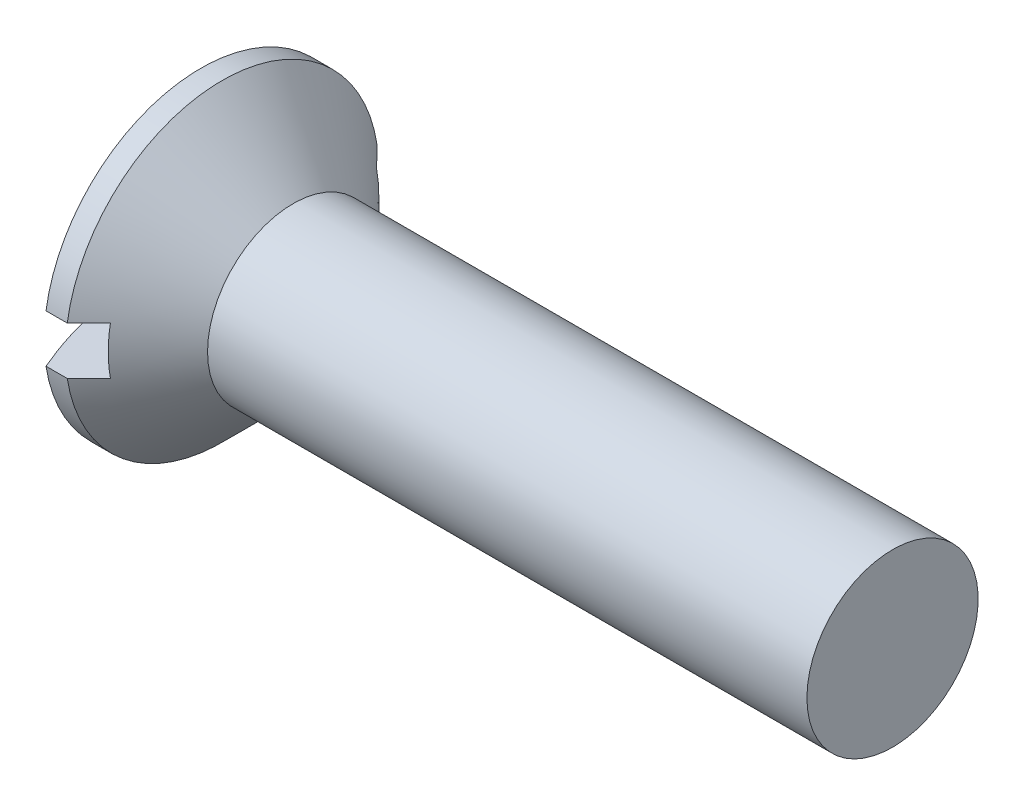
ISO-10303-21;
HEADER;
FILE_DESCRIPTION(('STEP AP214'),'2;1');
FILE_NAME('part.step','',(''),(''),'','','');
FILE_SCHEMA(('AUTOMOTIVE_DESIGN { 1 0 10303 214 1 1 1 1 }'));
ENDSEC;
DATA;
#1=APPLICATION_CONTEXT('core data for automotive mechanical design processes');
#2=APPLICATION_PROTOCOL_DEFINITION('international standard','automotive_design',2000,#1);
#3=PRODUCT_CONTEXT('',#1,'mechanical');
#4=PRODUCT('Part','Part','',(#3));
#5=PRODUCT_RELATED_PRODUCT_CATEGORY('part','',(#4));
#6=PRODUCT_DEFINITION_FORMATION('','',#4);
#7=PRODUCT_DEFINITION_CONTEXT('part definition',#1,'design');
#8=PRODUCT_DEFINITION('design','',#6,#7);
#9=PRODUCT_DEFINITION_SHAPE('','',#8);
#10=(LENGTH_UNIT() NAMED_UNIT(*) SI_UNIT(.MILLI.,.METRE.));
#11=(NAMED_UNIT(*) PLANE_ANGLE_UNIT() SI_UNIT($,.RADIAN.));
#12=(NAMED_UNIT(*) SI_UNIT($,.STERADIAN.) SOLID_ANGLE_UNIT());
#13=UNCERTAINTY_MEASURE_WITH_UNIT(LENGTH_MEASURE(1.E-05),#10,'distance_accuracy_value','');
#14=(GEOMETRIC_REPRESENTATION_CONTEXT(3) GLOBAL_UNCERTAINTY_ASSIGNED_CONTEXT((#13)) GLOBAL_UNIT_ASSIGNED_CONTEXT((#10,
#11,#12)) REPRESENTATION_CONTEXT('',''));
#15=CARTESIAN_POINT('',(0.,0.,0.));
#16=DIRECTION('',(0.,0.,1.));
#17=DIRECTION('',(1.,0.,0.));
#18=AXIS2_PLACEMENT_3D('',#15,#16,#17);
#19=CARTESIAN_POINT('',(4.4,-1.4,-9.15));
#20=DIRECTION('',(1.,0.,0.));
#21=DIRECTION('',(0.,0.,-1.));
#22=AXIS2_PLACEMENT_3D('',#19,#20,#21);
#23=PLANE('',#22);
#24=DIRECTION('',(0.,0.,-1.));
#25=VECTOR('',#24,1.);
#26=CARTESIAN_POINT('',(4.4,0.751153846153878,-9.15));
#27=LINE('',#26,#25);
#28=CARTESIAN_POINT('',(4.4,0.751153846153849,-0.751153846153847));
#29=VERTEX_POINT('',#28);
#30=CARTESIAN_POINT('',(4.4,0.751153846153854,-2.49538461538461));
#31=VERTEX_POINT('',#30);
#32=EDGE_CURVE('E205',#29,#31,#27,.T.);
#33=ORIENTED_EDGE('',*,*,#32,.F.);
#34=DIRECTION('',(0.,-1.,0.));
#35=VECTOR('',#34,1.);
#36=CARTESIAN_POINT('',(4.4,-1.4,-0.751153846153848));
#37=LINE('',#36,#35);
#38=CARTESIAN_POINT('',(4.4,1.4,-0.751153846153848));
#39=VERTEX_POINT('',#38);
#40=EDGE_CURVE('E324',#39,#29,#37,.T.);
#41=ORIENTED_EDGE('',*,*,#40,.F.);
#42=DIRECTION('',(0.,0.,-1.));
#43=VECTOR('',#42,1.);
#44=CARTESIAN_POINT('',(4.4,1.4,9.15));
#45=LINE('',#44,#43);
#46=CARTESIAN_POINT('',(4.4,1.4,-7.77372673048254));
#47=VERTEX_POINT('',#46);
#48=EDGE_CURVE('E57',#39,#47,#45,.T.);
#49=ORIENTED_EDGE('',*,*,#48,.T.);
#50=CARTESIAN_POINT('',(4.4,0.,0.));
#51=DIRECTION('',(1.,0.,0.));
#52=DIRECTION('',(0.,0.,-1.));
#53=AXIS2_PLACEMENT_3D('',#50,#51,#52);
#54=CIRCLE('',#53,7.89878644351262);
#55=CARTESIAN_POINT('',(4.4,-1.4,-7.77372673048254));
#56=VERTEX_POINT('',#55);
#57=EDGE_CURVE('E267',#56,#47,#54,.T.);
#58=ORIENTED_EDGE('',*,*,#57,.F.);
#59=DIRECTION('',(0.,0.,1.));
#60=VECTOR('',#59,1.);
#61=CARTESIAN_POINT('',(4.4,-1.4,-9.15));
#62=LINE('',#61,#60);
#63=CARTESIAN_POINT('',(4.4,-1.4,-0.751153846153848));
#64=VERTEX_POINT('',#63);
#65=EDGE_CURVE('E230',#56,#64,#62,.T.);
#66=ORIENTED_EDGE('',*,*,#65,.T.);
#67=CARTESIAN_POINT('',(4.4,-0.751153846153843,-0.751153846153847));
#68=VERTEX_POINT('',#67);
#69=EDGE_CURVE('E334',#68,#64,#37,.T.);
#70=ORIENTED_EDGE('',*,*,#69,.F.);
#71=DIRECTION('',(0.,0.,1.));
#72=VECTOR('',#71,1.);
#73=CARTESIAN_POINT('',(4.4,-0.751153846153813,-9.15));
#74=LINE('',#73,#72);
#75=CARTESIAN_POINT('',(4.4,-0.751153846153837,-2.49538461538462));
#76=VERTEX_POINT('',#75);
#77=EDGE_CURVE('E384',#76,#68,#74,.T.);
#78=ORIENTED_EDGE('',*,*,#77,.F.);
#79=DIRECTION('',(0.,1.,0.));
#80=VECTOR('',#79,1.);
#81=CARTESIAN_POINT('',(4.4,-1.40000000000002,-2.49538461538462));
#82=LINE('',#81,#80);
#83=EDGE_CURVE('E176',#76,#31,#82,.T.);
#84=ORIENTED_EDGE('',*,*,#83,.T.);
#85=EDGE_LOOP('',(#33,#41,#49,#58,#66,#70,#78,#84));
#86=FACE_BOUND('',#85,.T.);
#87=ADVANCED_FACE('F34',(#86),#23,.F.);
#88=DIRECTION('',(0.,0.,-1.));
#89=VECTOR('',#88,1.);
#90=CARTESIAN_POINT('',(4.4,0.751153846153878,-9.15));
#91=LINE('',#90,#89);
#92=CARTESIAN_POINT('',(4.4,0.751153846153837,2.49538461538461));
#93=VERTEX_POINT('',#92);
#94=CARTESIAN_POINT('',(4.4,0.751153846153844,0.751153846153845));
#95=VERTEX_POINT('',#94);
#96=EDGE_CURVE('E164',#93,#95,#91,.T.);
#97=ORIENTED_EDGE('',*,*,#96,.F.);
#98=DIRECTION('',(0.,-1.,0.));
#99=VECTOR('',#98,1.);
#100=CARTESIAN_POINT('',(4.4,-1.40000000000004,2.49538461538461));
#101=LINE('',#100,#99);
#102=CARTESIAN_POINT('',(4.4,-0.751153846153854,2.49538461538461));
#103=VERTEX_POINT('',#102);
#104=EDGE_CURVE('E175',#93,#103,#101,.T.);
#105=ORIENTED_EDGE('',*,*,#104,.T.);
#106=DIRECTION('',(0.,0.,1.));
#107=VECTOR('',#106,1.);
#108=CARTESIAN_POINT('',(4.4,-0.751153846153813,-9.15));
#109=LINE('',#108,#107);
#110=CARTESIAN_POINT('',(4.4,-0.751153846153849,0.751153846153845));
#111=VERTEX_POINT('',#110);
#112=EDGE_CURVE('E388',#111,#103,#109,.T.);
#113=ORIENTED_EDGE('',*,*,#112,.F.);
#114=DIRECTION('',(0.,1.,0.));
#115=VECTOR('',#114,1.);
#116=CARTESIAN_POINT('',(4.4,-1.4,0.751153846153844));
#117=LINE('',#116,#115);
#118=CARTESIAN_POINT('',(4.4,-1.4,0.751153846153844));
#119=VERTEX_POINT('',#118);
#120=EDGE_CURVE('E337',#119,#111,#117,.T.);
#121=ORIENTED_EDGE('',*,*,#120,.F.);
#122=CARTESIAN_POINT('',(4.4,-1.4,7.77372673048254));
#123=VERTEX_POINT('',#122);
#124=EDGE_CURVE('E229',#119,#123,#62,.T.);
#125=ORIENTED_EDGE('',*,*,#124,.T.);
#126=CARTESIAN_POINT('',(4.4,1.4,7.77372673048254));
#127=VERTEX_POINT('',#126);
#128=EDGE_CURVE('E271',#127,#123,#54,.T.);
#129=ORIENTED_EDGE('',*,*,#128,.F.);
#130=CARTESIAN_POINT('',(4.4,1.4,0.751153846153845));
#131=VERTEX_POINT('',#130);
#132=EDGE_CURVE('E226',#127,#131,#45,.T.);
#133=ORIENTED_EDGE('',*,*,#132,.T.);
#134=EDGE_CURVE('E354',#95,#131,#117,.T.);
#135=ORIENTED_EDGE('',*,*,#134,.F.);
#136=EDGE_LOOP('',(#97,#105,#113,#121,#125,#129,#133,#135));
#137=FACE_BOUND('',#136,.T.);
#138=ADVANCED_FACE('F315',(#137),#23,.F.);
#139=CARTESIAN_POINT('',(7.91393402264894,0.,-0.484537173806007));
#140=DIRECTION('',(-0.0756566651152588,0.,0.997133927325531));
#141=DIRECTION('',(0.997133927325531,0.,0.0756566651152588));
#142=AXIS2_PLACEMENT_3D('',#139,#140,#141);
#143=PLANE('',#142);
#144=ORIENTED_EDGE('',*,*,#40,.T.);
#145=DIRECTION('',(0.994292357349116,-0.0754410634771884,0.0754410634771882));
#146=VECTOR('',#145,1.);
#147=CARTESIAN_POINT('',(7.95027938516743,0.48177950119534,-0.481779501195338));
#148=LINE('',#147,#146);
#149=CARTESIAN_POINT('',(7.15,0.542500000000002,-0.542499999999998));
#150=VERTEX_POINT('',#149);
#151=EDGE_CURVE('E328',#29,#150,#148,.T.);
#152=ORIENTED_EDGE('',*,*,#151,.T.);
#153=DIRECTION('',(0.813773502738753,-0.577893001420423,0.0617443531798285));
#154=VECTOR('',#153,1.);
#155=CARTESIAN_POINT('',(0.,5.62,-1.085));
#156=LINE('',#155,#154);
#157=CARTESIAN_POINT('',(0.617987345860282,5.18114255264257,-1.03811075033158));
#158=VERTEX_POINT('',#157);
#159=EDGE_CURVE('E187',#158,#150,#156,.T.);
#160=ORIENTED_EDGE('',*,*,#159,.F.);
#161=CARTESIAN_POINT('',(22.8507741936033,0.,0.648782517486683));
#162=DIRECTION('',(-0.0756566651152588,0.,0.997133927325531));
#163=DIRECTION('',(0.997133927325531,0.,0.0756566651152588));
#164=AXIS2_PLACEMENT_3D('',#161,#162,#163);
#165=CIRCLE('',#164,22.8907548600956);
#166=CARTESIAN_POINT('',(0.0683552371710354,1.4,-1.07981360613073));
#167=VERTEX_POINT('',#166);
#168=EDGE_CURVE('E223',#167,#158,#165,.F.);
#169=ORIENTED_EDGE('',*,*,#168,.F.);
#170=DIRECTION('',(0.997133927325531,0.,0.0756566651152588));
#171=VECTOR('',#170,1.);
#172=CARTESIAN_POINT('',(5.14694133934077,1.4,-0.694480324952115));
#173=LINE('',#172,#171);
#174=EDGE_CURVE('E218',#167,#39,#173,.T.);
#175=ORIENTED_EDGE('',*,*,#174,.T.);
#176=EDGE_LOOP('',(#144,#152,#160,#169,#175));
#177=FACE_BOUND('',#176,.T.);
#178=ADVANCED_FACE('F319',(#177),#143,.T.);
#179=DIRECTION('',(0.813773502738753,0.577893001420423,0.0617443531798285));
#180=VECTOR('',#179,1.);
#181=CARTESIAN_POINT('',(0.,-5.62,-1.085));
#182=LINE('',#181,#180);
#183=CARTESIAN_POINT('',(0.617987345860282,-5.18114255264258,-1.03811075033158));
#184=VERTEX_POINT('',#183);
#185=CARTESIAN_POINT('',(7.15,-0.5425,-0.5425));
#186=VERTEX_POINT('',#185);
#187=EDGE_CURVE('E188',#184,#186,#182,.T.);
#188=ORIENTED_EDGE('',*,*,#187,.T.);
#189=DIRECTION('',(-0.994292357349116,-0.0754410634771878,-0.0754410634771882));
#190=VECTOR('',#189,1.);
#191=CARTESIAN_POINT('',(7.95027938516743,-0.481779501195337,-0.481779501195339));
#192=LINE('',#191,#190);
#193=EDGE_CURVE('E386',#186,#68,#192,.T.);
#194=ORIENTED_EDGE('',*,*,#193,.T.);
#195=ORIENTED_EDGE('',*,*,#69,.T.);
#196=DIRECTION('',(-0.997133927325531,0.,-0.0756566651152588));
#197=VECTOR('',#196,1.);
#198=CARTESIAN_POINT('',(3.7663924939912,-1.4,-0.799228261819549));
#199=LINE('',#198,#197);
#200=CARTESIAN_POINT('',(0.0683552371710319,-1.4,-1.07981360613073));
#201=VERTEX_POINT('',#200);
#202=EDGE_CURVE('E216',#64,#201,#199,.T.);
#203=ORIENTED_EDGE('',*,*,#202,.T.);
#204=CARTESIAN_POINT('',(22.8507741936033,0.,0.648782517486683));
#205=DIRECTION('',(-0.0756566651152588,0.,0.997133927325531));
#206=DIRECTION('',(0.997133927325531,0.,0.0756566651152588));
#207=AXIS2_PLACEMENT_3D('',#204,#205,#206);
#208=CIRCLE('',#207,22.8907548600956);
#209=EDGE_CURVE('E220',#184,#201,#208,.F.);
#210=ORIENTED_EDGE('',*,*,#209,.F.);
#211=EDGE_LOOP('',(#188,#194,#195,#203,#210));
#212=FACE_BOUND('',#211,.T.);
#213=ADVANCED_FACE('F371',(#212),#143,.T.);
#214=CARTESIAN_POINT('',(7.91393402264894,0.,0.484537173806007));
#215=DIRECTION('',(-0.0756566651152587,0.,-0.997133927325531));
#216=DIRECTION('',(-0.997133927325531,0.,0.0756566651152587));
#217=AXIS2_PLACEMENT_3D('',#214,#215,#216);
#218=PLANE('',#217);
#219=DIRECTION('',(0.813773502738753,-0.577893001420423,-0.0617443531798285));
#220=VECTOR('',#219,1.);
#221=CARTESIAN_POINT('',(0.,5.62,1.085));
#222=LINE('',#221,#220);
#223=CARTESIAN_POINT('',(0.617987345860278,5.18114255264258,1.03811075033158));
#224=VERTEX_POINT('',#223);
#225=CARTESIAN_POINT('',(7.15,0.542499999999998,0.542500000000002));
#226=VERTEX_POINT('',#225);
#227=EDGE_CURVE('E180',#224,#226,#222,.T.);
#228=ORIENTED_EDGE('',*,*,#227,.T.);
#229=DIRECTION('',(-0.994292357349116,0.0754410634771879,0.0754410634771881));
#230=VECTOR('',#229,1.);
#231=CARTESIAN_POINT('',(7.95027938516743,0.481779501195337,0.481779501195339));
#232=LINE('',#231,#230);
#233=EDGE_CURVE('E11',#226,#95,#232,.T.);
#234=ORIENTED_EDGE('',*,*,#233,.T.);
#235=ORIENTED_EDGE('',*,*,#134,.T.);
#236=DIRECTION('',(-0.997133927325531,0.,0.0756566651152587));
#237=VECTOR('',#236,1.);
#238=CARTESIAN_POINT('',(3.7663924939912,1.4,0.799228261819549));
#239=LINE('',#238,#237);
#240=CARTESIAN_POINT('',(0.0683552371710319,1.4,1.07981360613073));
#241=VERTEX_POINT('',#240);
#242=EDGE_CURVE('E210',#131,#241,#239,.T.);
#243=ORIENTED_EDGE('',*,*,#242,.T.);
#244=CARTESIAN_POINT('',(22.8507741936033,0.,-0.648782517486681));
#245=DIRECTION('',(-0.0756566651152587,0.,-0.997133927325531));
#246=DIRECTION('',(-0.997133927325531,0.,0.0756566651152587));
#247=AXIS2_PLACEMENT_3D('',#244,#245,#246);
#248=CIRCLE('',#247,22.8907548600956);
#249=EDGE_CURVE('E183',#224,#241,#248,.F.);
#250=ORIENTED_EDGE('',*,*,#249,.F.);
#251=EDGE_LOOP('',(#228,#234,#235,#243,#250));
#252=FACE_BOUND('',#251,.T.);
#253=ADVANCED_FACE('F181',(#252),#218,.T.);
#254=ORIENTED_EDGE('',*,*,#120,.T.);
#255=DIRECTION('',(0.994292357349116,0.0754410634771883,-0.0754410634771881));
#256=VECTOR('',#255,1.);
#257=CARTESIAN_POINT('',(7.95027938516743,-0.48177950119534,0.481779501195338));
#258=LINE('',#257,#256);
#259=CARTESIAN_POINT('',(7.15,-0.5425,0.5425));
#260=VERTEX_POINT('',#259);
#261=EDGE_CURVE('E390',#111,#260,#258,.T.);
#262=ORIENTED_EDGE('',*,*,#261,.T.);
#263=DIRECTION('',(0.813773502738753,0.577893001420422,-0.0617443531798284));
#264=VECTOR('',#263,1.);
#265=CARTESIAN_POINT('',(0.,-5.62,1.085));
#266=LINE('',#265,#264);
#267=CARTESIAN_POINT('',(0.617987345860282,-5.18114255264258,1.03811075033158));
#268=VERTEX_POINT('',#267);
#269=EDGE_CURVE('E377',#268,#260,#266,.T.);
#270=ORIENTED_EDGE('',*,*,#269,.F.);
#271=CARTESIAN_POINT('',(22.8507741936033,0.,-0.648782517486681));
#272=DIRECTION('',(-0.0756566651152587,0.,-0.997133927325531));
#273=DIRECTION('',(-0.997133927325531,0.,0.0756566651152587));
#274=AXIS2_PLACEMENT_3D('',#271,#272,#273);
#275=CIRCLE('',#274,22.8907548600956);
#276=CARTESIAN_POINT('',(0.0683552371710319,-1.4,1.07981360613073));
#277=VERTEX_POINT('',#276);
#278=EDGE_CURVE('E212',#277,#268,#275,.F.);
#279=ORIENTED_EDGE('',*,*,#278,.F.);
#280=DIRECTION('',(0.997133927325531,0.,-0.0756566651152587));
#281=VECTOR('',#280,1.);
#282=CARTESIAN_POINT('',(5.14694133934077,-1.4,0.694480324952115));
#283=LINE('',#282,#281);
#284=EDGE_CURVE('E49',#277,#119,#283,.T.);
#285=ORIENTED_EDGE('',*,*,#284,.T.);
#286=EDGE_LOOP('',(#254,#262,#270,#279,#285));
#287=FACE_BOUND('',#286,.T.);
#288=ADVANCED_FACE('F401',(#287),#218,.T.);
#289=CARTESIAN_POINT('',(22.9,0.,0.));
#290=DIRECTION('',(-1.,0.,0.));
#291=DIRECTION('',(0.,-1.,0.));
#292=AXIS2_PLACEMENT_3D('',#289,#290,#291);
#293=SPHERICAL_SURFACE('',#292,22.9);
#294=CARTESIAN_POINT('',(22.9,1.4,0.));
#295=DIRECTION('',(0.,1.,0.));
#296=DIRECTION('',(0.,0.,1.));
#297=AXIS2_PLACEMENT_3D('',#294,#295,#296);
#298=CIRCLE('',#297,22.8571651785605);
#299=CARTESIAN_POINT('',(1.90744179476927,1.4,-9.0422618851701));
#300=VERTEX_POINT('',#299);
#301=EDGE_CURVE('E246',#167,#300,#298,.F.);
#302=ORIENTED_EDGE('',*,*,#301,.F.);
#303=ORIENTED_EDGE('',*,*,#168,.T.);
#304=CARTESIAN_POINT('',(17.8760956364067,-7.07452805508461,0.));
#305=DIRECTION('',(0.57899773071887,0.815329153055622,0.));
#306=DIRECTION('',(-0.815329153055622,0.57899773071887,0.));
#307=AXIS2_PLACEMENT_3D('',#304,#305,#306);
#308=CIRCLE('',#307,21.1924854074101);
#309=EDGE_CURVE('E42',#224,#158,#308,.F.);
#310=ORIENTED_EDGE('',*,*,#309,.F.);
#311=ORIENTED_EDGE('',*,*,#249,.T.);
#312=CARTESIAN_POINT('',(1.90744179476927,1.4,9.04226188517011));
#313=VERTEX_POINT('',#312);
#314=EDGE_CURVE('E247',#313,#241,#298,.F.);
#315=ORIENTED_EDGE('',*,*,#314,.F.);
#316=CARTESIAN_POINT('',(1.90744179476927,0.,0.));
#317=DIRECTION('',(-1.,0.,0.));
#318=DIRECTION('',(0.,0.,1.));
#319=AXIS2_PLACEMENT_3D('',#316,#317,#318);
#320=CIRCLE('',#319,9.15);
#321=EDGE_CURVE('E266',#313,#300,#320,.T.);
#322=ORIENTED_EDGE('',*,*,#321,.T.);
#323=EDGE_LOOP('',(#302,#303,#310,#311,#315,#322));
#324=FACE_BOUND('',#323,.T.);
#325=ADVANCED_FACE('F341',(#324),#293,.T.);
#326=CARTESIAN_POINT('',(17.8760956364067,7.07452805508461,0.));
#327=DIRECTION('',(0.57899773071887,-0.815329153055622,0.));
#328=DIRECTION('',(0.815329153055622,0.57899773071887,0.));
#329=AXIS2_PLACEMENT_3D('',#326,#327,#328);
#330=CIRCLE('',#329,21.1924854074101);
#331=EDGE_CURVE('E333',#184,#268,#330,.F.);
#332=ORIENTED_EDGE('',*,*,#331,.F.);
#333=ORIENTED_EDGE('',*,*,#209,.T.);
#334=CARTESIAN_POINT('',(22.9,-1.4,0.));
#335=DIRECTION('',(0.,-1.,0.));
#336=DIRECTION('',(0.,0.,-1.));
#337=AXIS2_PLACEMENT_3D('',#334,#335,#336);
#338=CIRCLE('',#337,22.8571651785605);
#339=CARTESIAN_POINT('',(1.90744179476927,-1.4,-9.04226188517011));
#340=VERTEX_POINT('',#339);
#341=EDGE_CURVE('E237',#340,#201,#338,.F.);
#342=ORIENTED_EDGE('',*,*,#341,.F.);
#343=CARTESIAN_POINT('',(1.90744179476927,-1.4,9.0422618851701));
#344=VERTEX_POINT('',#343);
#345=EDGE_CURVE('E263',#340,#344,#320,.T.);
#346=ORIENTED_EDGE('',*,*,#345,.T.);
#347=EDGE_CURVE('E236',#277,#344,#338,.F.);
#348=ORIENTED_EDGE('',*,*,#347,.F.);
#349=ORIENTED_EDGE('',*,*,#278,.T.);
#350=EDGE_LOOP('',(#332,#333,#342,#346,#348,#349));
#351=FACE_BOUND('',#350,.T.);
#352=ADVANCED_FACE('F301',(#351),#293,.T.);
#353=CARTESIAN_POINT('',(4.4,1.4,9.15));
#354=DIRECTION('',(0.,1.,0.));
#355=DIRECTION('',(0.,0.,1.));
#356=AXIS2_PLACEMENT_3D('',#353,#354,#355);
#357=PLANE('',#356);
#358=ORIENTED_EDGE('',*,*,#174,.F.);
#359=ORIENTED_EDGE('',*,*,#301,.T.);
#360=DIRECTION('',(-1.,0.,0.));
#361=VECTOR('',#360,1.);
#362=CARTESIAN_POINT('',(-15.875,1.4,-9.0422618851701));
#363=LINE('',#362,#361);
#364=CARTESIAN_POINT('',(3.14878644351263,1.4,-9.0422618851701));
#365=VERTEX_POINT('',#364);
#366=EDGE_CURVE('E243',#365,#300,#363,.T.);
#367=ORIENTED_EDGE('',*,*,#366,.F.);
#368=CARTESIAN_POINT('',(-7.857048146597,1.4,20.1071546476338));
#369=CARTESIAN_POINT('',(-7.16240173454339,1.4,19.4108129604451));
#370=CARTESIAN_POINT('',(-6.4678297758022,1.4,18.7143969459536));
#371=CARTESIAN_POINT('',(-5.0789137994183,1.4,17.3213021944131));
#372=CARTESIAN_POINT('',(-4.384569788051,1.4,16.6246234511077));
#373=CARTESIAN_POINT('',(-2.9958169251593,1.4,15.2305158546289));
#374=CARTESIAN_POINT('',(-2.30140827464231,1.4,14.5330868011787));
#375=CARTESIAN_POINT('',(-0.913133661235677,1.4,13.1377232868626));
#376=CARTESIAN_POINT('',(-0.219267685269571,1.4,12.4397888390074));
#377=CARTESIAN_POINT('',(1.16766516004261,1.4,11.0430452680403));
#378=CARTESIAN_POINT('',(1.860731980637,1.4,10.3442360964824));
#379=CARTESIAN_POINT('',(2.89921288895363,1.4,9.29486121439367));
#380=CARTESIAN_POINT('',(3.24519991186702,1.4,8.94486259435679));
#381=CARTESIAN_POINT('',(3.93662486381058,1.4,8.24432826145728));
#382=CARTESIAN_POINT('',(4.28206279690165,1.4,7.89379255260482));
#383=CARTESIAN_POINT('',(4.97201098407667,1.4,7.19206058266475));
#384=CARTESIAN_POINT('',(5.31652153057943,1.4,6.84086460915768));
#385=CARTESIAN_POINT('',(6.0043198550081,1.4,6.1372554152688));
#386=CARTESIAN_POINT('',(6.34760759767043,1.4,5.78484216035078));
#387=CARTESIAN_POINT('',(6.86094083207756,1.4,5.25471885267416));
#388=CARTESIAN_POINT('',(7.03177435251846,1.4,5.07777217670582));
#389=CARTESIAN_POINT('',(7.3727219976139,1.4,4.72318743380958));
#390=CARTESIAN_POINT('',(7.54283612457629,1.4,4.5455493691032));
#391=CARTESIAN_POINT('',(7.88205567895868,1.4,4.18932774848586));
#392=CARTESIAN_POINT('',(8.05116115256099,1.4,4.010744236581));
#393=CARTESIAN_POINT('',(8.38792170913193,1.4,3.6522159938797));
#394=CARTESIAN_POINT('',(8.55557681829037,1.4,3.47227128777332));
#395=CARTESIAN_POINT('',(8.76748560072488,1.4,3.24198243681544));
#396=CARTESIAN_POINT('',(8.81277819707361,1.4,3.19259415231655));
#397=CARTESIAN_POINT('',(8.90317039805928,1.4,3.09364104016524));
#398=CARTESIAN_POINT('',(8.94827000208926,1.4,3.0440762119585));
#399=CARTESIAN_POINT('',(9.08324361960469,1.4,2.8950805018967));
#400=CARTESIAN_POINT('',(9.17278950728053,1.4,2.79535157355364));
#401=CARTESIAN_POINT('',(9.3508320888316,1.4,2.59472118043883));
#402=CARTESIAN_POINT('',(9.43932721937955,1.4,2.4938183259168));
#403=CARTESIAN_POINT('',(9.614699972968,1.4,2.29062509774684));
#404=CARTESIAN_POINT('',(9.70157772808994,1.4,2.18833483858974));
#405=CARTESIAN_POINT('',(9.85908268519032,1.4,1.99861822286032));
#406=CARTESIAN_POINT('',(9.93005523883935,1.4,1.91147949716551));
#407=CARTESIAN_POINT('',(10.0697225589233,1.4,1.73539857671608));
#408=CARTESIAN_POINT('',(10.1384175632151,1.4,1.64645657186115));
#409=CARTESIAN_POINT('',(10.2724705720187,1.4,1.46615153054903));
#410=CARTESIAN_POINT('',(10.3378304303692,1.4,1.37478988291309));
#411=CARTESIAN_POINT('',(10.4635064959422,1.4,1.18868577560423));
#412=CARTESIAN_POINT('',(10.5238261057651,1.4,1.09394565935052));
#413=CARTESIAN_POINT('',(10.6326133150829,1.4,0.906410779158184));
#414=CARTESIAN_POINT('',(10.6816099494598,1.4,0.813927939950042));
#415=CARTESIAN_POINT('',(10.768441254158,1.4,0.623741334762394));
#416=CARTESIAN_POINT('',(10.8062957802322,1.4,0.526047227156338));
#417=CARTESIAN_POINT('',(10.8471996480684,1.4,0.385477581345689));
#418=CARTESIAN_POINT('',(10.8575324900997,1.4,0.344715229152776));
#419=CARTESIAN_POINT('',(10.8749530279124,1.4,0.262512597980199));
#420=CARTESIAN_POINT('',(10.882042416588,1.4,0.22107268437381));
#421=CARTESIAN_POINT('',(10.8926248599701,1.4,0.137809044984982));
#422=CARTESIAN_POINT('',(10.896124636229,1.4,0.0959861850436));
#423=CARTESIAN_POINT('',(10.8993592539135,1.4,0.0121930480465017));
#424=CARTESIAN_POINT('',(10.899094143624,1.4,-0.0297772271117035));
#425=CARTESIAN_POINT('',(10.8948149534949,1.4,-0.113507966191157));
#426=CARTESIAN_POINT('',(10.8908022173129,1.4,-0.155268499917299));
#427=CARTESIAN_POINT('',(10.8792459740393,1.4,-0.238299671163265));
#428=CARTESIAN_POINT('',(10.8717017006016,1.4,-0.279570200357654));
#429=CARTESIAN_POINT('',(10.8534259161864,1.4,-0.361477258398673));
#430=CARTESIAN_POINT('',(10.8426880522661,1.4,-0.402112351974105));
#431=CARTESIAN_POINT('',(10.8184565568997,1.4,-0.482540705127475));
#432=CARTESIAN_POINT('',(10.8049629204321,1.4,-0.522333963171272));
#433=CARTESIAN_POINT('',(10.7534817229732,1.4,-0.66062373817725));
#434=CARTESIAN_POINT('',(10.7093295480848,1.4,-0.756824096864698));
#435=CARTESIAN_POINT('',(10.611885326994,1.4,-0.944505351940633));
#436=CARTESIAN_POINT('',(10.5585722859902,1.4,-1.03597476523033));
#437=CARTESIAN_POINT('',(10.4457034448116,1.4,-1.21608752073851));
#438=CARTESIAN_POINT('',(10.3860957462745,1.4,-1.30469799229635));
#439=CARTESIAN_POINT('',(10.2938557677635,1.4,-1.4355101257757));
#440=CARTESIAN_POINT('',(10.2626548857484,1.4,-1.47874135004981));
#441=CARTESIAN_POINT('',(10.1994575270918,1.4,-1.56461754012874));
#442=CARTESIAN_POINT('',(10.1674610779967,1.4,-1.60726252615286));
#443=CARTESIAN_POINT('',(10.0628879562799,1.4,-1.74442534089264));
#444=CARTESIAN_POINT('',(9.98900731385959,1.4,-1.83794788506663));
#445=CARTESIAN_POINT('',(9.83902850276875,1.4,-2.02320270323648));
#446=CARTESIAN_POINT('',(9.76293004312599,1.4,-2.11493473966193));
#447=CARTESIAN_POINT('',(9.60912484168818,1.4,-2.29709862281036));
#448=CARTESIAN_POINT('',(9.53141748345873,1.4,-2.38752994781703));
#449=CARTESIAN_POINT('',(9.37483606047006,1.4,-2.56737831217361));
#450=CARTESIAN_POINT('',(9.29596196265418,1.4,-2.65679532265813));
#451=CARTESIAN_POINT('',(9.05779287389105,1.4,-2.92415166595302));
#452=CARTESIAN_POINT('',(8.89718647029795,1.4,-3.10092142858316));
#453=CARTESIAN_POINT('',(8.57389696740277,1.4,-3.45246333870868));
#454=CARTESIAN_POINT('',(8.41121436586402,1.4,-3.62723594665571));
#455=CARTESIAN_POINT('',(8.08537487251062,1.4,-3.97447019281041));
#456=CARTESIAN_POINT('',(7.92222595701649,1.4,-4.14693932344164));
#457=CARTESIAN_POINT('',(7.59495611049466,1.4,-4.49097115507894));
#458=CARTESIAN_POINT('',(7.43083512155191,1.4,-4.6625338009017));
#459=CARTESIAN_POINT('',(7.10204178600474,1.4,-5.00483942893845));
#460=CARTESIAN_POINT('',(6.93737005150631,1.4,-5.17558299948488));
#461=CARTESIAN_POINT('',(6.60751048719549,1.4,-5.51656403220254));
#462=CARTESIAN_POINT('',(6.44232266764926,1.4,-5.68680150431145));
#463=CARTESIAN_POINT('',(5.9863704667772,1.4,-6.1556036785396));
#464=CARTESIAN_POINT('',(5.69519498223811,1.4,-6.45376844863838));
#465=CARTESIAN_POINT('',(5.11204491625998,1.4,-7.04931578921057));
#466=CARTESIAN_POINT('',(4.82007033331758,1.4,-7.34669835821034));
#467=CARTESIAN_POINT('',(3.94332156132855,1.4,-8.23804831778499));
#468=CARTESIAN_POINT('',(3.35772932502353,1.4,-8.83121081657676));
#469=CARTESIAN_POINT('',(2.18515182482223,1.4,-10.0166346047705));
#470=CARTESIAN_POINT('',(1.5981660901182,1.4,-10.608895427841));
#471=CARTESIAN_POINT('',(0.423490142339192,1.4,-11.7927119429328));
#472=CARTESIAN_POINT('',(-0.164200067090348,1.4,-12.3842676385716));
#473=CARTESIAN_POINT('',(-1.3437173604148,1.4,-13.57062832245));
#474=CARTESIAN_POINT('',(-1.93554730660023,1.4,-14.1654304639677));
#475=CARTESIAN_POINT('',(-3.11952448746137,1.4,-15.3547209005296));
#476=CARTESIAN_POINT('',(-3.71167172268395,1.4,-15.9492091950294));
#477=CARTESIAN_POINT('',(-4.89593038537907,1.4,-17.1377013051511));
#478=CARTESIAN_POINT('',(-5.4880417144001,1.4,-17.7317052188847));
#479=CARTESIAN_POINT('',(-6.67243238017531,1.4,-18.9195432987571));
#480=CARTESIAN_POINT('',(-7.26471171661067,1.4,-19.5133774652138));
#481=CARTESIAN_POINT('',(-7.857048146597,1.4,-20.1071546476338));
#482=B_SPLINE_CURVE_WITH_KNOTS('',3,(#368,#369,#370,#371,#372,#373,#374,#375,#376,#377,#378,
#379,#380,#381,#382,#383,#384,#385,#386,#387,#388,#389,#390,#391,#392,#393,#394,#395,#396,#397,
#398,#399,#400,#401,#402,#403,#404,#405,#406,#407,#408,#409,#410,#411,#412,#413,#414,#415,#416,
#417,#418,#419,#420,#421,#422,#423,#424,#425,#426,#427,#428,#429,#430,#431,#432,#433,#434,#435,
#436,#437,#438,#439,#440,#441,#442,#443,#444,#445,#446,#447,#448,#449,#450,#451,#452,#453,#454,
#455,#456,#457,#458,#459,#460,#461,#462,#463,#464,#465,#466,#467,#468,#469,#470,#471,#472,#473,
#474,#475,#476,#477,#478,#479,#480,#481),.UNSPECIFIED.,.F.,.F.,(4,2,2,2,2,2,2,2,2,2,2,2,2,2,2,2,
2,2,2,2,2,2,2,2,2,2,2,2,2,2,2,2,2,2,2,2,2,2,2,2,2,2,2,2,2,2,2,2,2,2,2,2,2,2,2,2,4),(0.,
2.95073359407433,5.90154255818966,8.85408293577678,11.8065498294877,14.7591881989668,
16.2356208592745,17.7120425490257,19.1879257011809,20.6638510761937,21.4017169027718,
22.1395803604379,22.8774097708,23.6152258299532,23.8162616875221,24.0172981768781,
24.4193841275236,24.822007818635,25.2245984843388,25.5617262926141,25.8988187811676,
26.235721809078,26.5723955294152,26.8859876715845,27.199017546805,27.3250632696833,
27.4510431287469,27.5767866573558,27.7025285732978,27.8282254235802,27.95394956282,
28.0799254946008,28.2059016559374,28.5225219893391,28.8398778721668,29.1600918734327,
29.3200304264684,29.4799634493304,29.8374587586641,30.195001183552,30.5526832297956,
30.9103754295592,31.6268452767873,32.3431464638664,33.0553686393294,33.7676336838244,
34.4792720911143,35.1908964312364,36.4411611781847,37.6914282788898,40.191992435808,
42.6935766385267,45.1951479517227,47.7123824981423,50.2296213972852,52.7457549587565,
55.2618837771683),.UNSPECIFIED.);
#483=EDGE_CURVE('E279',#47,#365,#482,.T.);
#484=ORIENTED_EDGE('',*,*,#483,.F.);
#485=ORIENTED_EDGE('',*,*,#48,.F.);
#486=EDGE_LOOP('',(#358,#359,#367,#484,#485));
#487=FACE_BOUND('',#486,.T.);
#488=ADVANCED_FACE('F298',(#487),#357,.F.);
#489=ORIENTED_EDGE('',*,*,#242,.F.);
#490=ORIENTED_EDGE('',*,*,#132,.F.);
#491=CARTESIAN_POINT('',(3.14878644351263,1.4,9.0422618851701));
#492=VERTEX_POINT('',#491);
#493=EDGE_CURVE('E353',#492,#127,#482,.T.);
#494=ORIENTED_EDGE('',*,*,#493,.F.);
#495=DIRECTION('',(-1.,0.,0.));
#496=VECTOR('',#495,1.);
#497=CARTESIAN_POINT('',(-15.875,1.4,9.0422618851701));
#498=LINE('',#497,#496);
#499=EDGE_CURVE('E250',#313,#492,#498,.F.);
#500=ORIENTED_EDGE('',*,*,#499,.F.);
#501=ORIENTED_EDGE('',*,*,#314,.T.);
#502=EDGE_LOOP('',(#489,#490,#494,#500,#501));
#503=FACE_BOUND('',#502,.T.);
#504=ADVANCED_FACE('F295',(#503),#357,.F.);
#505=CARTESIAN_POINT('',(4.4,-1.4,-9.15));
#506=DIRECTION('',(0.,-1.,0.));
#507=DIRECTION('',(0.,0.,-1.));
#508=AXIS2_PLACEMENT_3D('',#505,#506,#507);
#509=PLANE('',#508);
#510=ORIENTED_EDGE('',*,*,#202,.F.);
#511=ORIENTED_EDGE('',*,*,#65,.F.);
#512=CARTESIAN_POINT('',(-7.85704814659701,-1.4,-20.1071546476338));
#513=CARTESIAN_POINT('',(-7.16240173454339,-1.4,-19.4108129604451));
#514=CARTESIAN_POINT('',(-6.46782977580221,-1.4,-18.7143969459537));
#515=CARTESIAN_POINT('',(-5.07891379941831,-1.4,-17.3213021944131));
#516=CARTESIAN_POINT('',(-4.38456978805102,-1.4,-16.6246234511077));
#517=CARTESIAN_POINT('',(-2.99581692515932,-1.4,-15.230515854629));
#518=CARTESIAN_POINT('',(-2.30140827464233,-1.4,-14.5330868011788));
#519=CARTESIAN_POINT('',(-0.913133661235703,-1.4,-13.1377232868626));
#520=CARTESIAN_POINT('',(-0.2192676852696,-1.4,-12.4397888390075));
#521=CARTESIAN_POINT('',(1.16766516004258,-1.4,-11.0430452680403));
#522=CARTESIAN_POINT('',(1.86073198063698,-1.4,-10.3442360964825));
#523=CARTESIAN_POINT('',(2.89921288895361,-1.4,-9.29486121439369));
#524=CARTESIAN_POINT('',(3.245199911867,-1.4,-8.94486259435681));
#525=CARTESIAN_POINT('',(3.93662486381056,-1.4,-8.2443282614573));
#526=CARTESIAN_POINT('',(4.28206279690164,-1.4,-7.89379255260484));
#527=CARTESIAN_POINT('',(4.97201098407666,-1.4,-7.19206058266476));
#528=CARTESIAN_POINT('',(5.31652153057942,-1.4,-6.84086460915769));
#529=CARTESIAN_POINT('',(6.0043198550081,-1.4,-6.1372554152688));
#530=CARTESIAN_POINT('',(6.34760759767043,-1.4,-5.78484216035078));
#531=CARTESIAN_POINT('',(6.86094083207756,-1.4,-5.25471885267416));
#532=CARTESIAN_POINT('',(7.03177435251846,-1.4,-5.07777217670582));
#533=CARTESIAN_POINT('',(7.3727219976139,-1.4,-4.72318743380958));
#534=CARTESIAN_POINT('',(7.54283612457629,-1.4,-4.5455493691032));
#535=CARTESIAN_POINT('',(7.88205567895868,-1.4,-4.18932774848585));
#536=CARTESIAN_POINT('',(8.05116115256099,-1.4,-4.010744236581));
#537=CARTESIAN_POINT('',(8.38792170913193,-1.4,-3.6522159938797));
#538=CARTESIAN_POINT('',(8.55557681829037,-1.4,-3.47227128777332));
#539=CARTESIAN_POINT('',(8.76748560072488,-1.4,-3.24198243681544));
#540=CARTESIAN_POINT('',(8.81277819707361,-1.4,-3.19259415231655));
#541=CARTESIAN_POINT('',(8.90317039805928,-1.4,-3.09364104016524));
#542=CARTESIAN_POINT('',(8.94827000208926,-1.4,-3.04407621195849));
#543=CARTESIAN_POINT('',(9.08324361960469,-1.4,-2.8950805018967));
#544=CARTESIAN_POINT('',(9.17278950728053,-1.4,-2.79535157355364));
#545=CARTESIAN_POINT('',(9.3508320888316,-1.4,-2.59472118043883));
#546=CARTESIAN_POINT('',(9.43932721937955,-1.4,-2.49381832591679));
#547=CARTESIAN_POINT('',(9.614699972968,-1.4,-2.29062509774683));
#548=CARTESIAN_POINT('',(9.70157772808994,-1.4,-2.18833483858974));
#549=CARTESIAN_POINT('',(9.85908268519032,-1.4,-1.99861822286031));
#550=CARTESIAN_POINT('',(9.93005523883936,-1.4,-1.91147949716551));
#551=CARTESIAN_POINT('',(10.0697225589233,-1.4,-1.73539857671608));
#552=CARTESIAN_POINT('',(10.1384175632151,-1.4,-1.64645657186115));
#553=CARTESIAN_POINT('',(10.2724705720187,-1.4,-1.46615153054904));
#554=CARTESIAN_POINT('',(10.3378304303692,-1.4,-1.37478988291309));
#555=CARTESIAN_POINT('',(10.4635064959422,-1.4,-1.18868577560423));
#556=CARTESIAN_POINT('',(10.5238261057651,-1.4,-1.09394565935053));
#557=CARTESIAN_POINT('',(10.6326133150829,-1.4,-0.906410779158186));
#558=CARTESIAN_POINT('',(10.6816099494598,-1.4,-0.813927939950045));
#559=CARTESIAN_POINT('',(10.768441254158,-1.4,-0.623741334762397));
#560=CARTESIAN_POINT('',(10.8062957802322,-1.4,-0.526047227156341));
#561=CARTESIAN_POINT('',(10.8471996480684,-1.4,-0.385477581345692));
#562=CARTESIAN_POINT('',(10.8575324900997,-1.4,-0.344715229152779));
#563=CARTESIAN_POINT('',(10.8749530279124,-1.4,-0.262512597980203));
#564=CARTESIAN_POINT('',(10.882042416588,-1.4,-0.221072684373813));
#565=CARTESIAN_POINT('',(10.8926248599701,-1.4,-0.137809044984985));
#566=CARTESIAN_POINT('',(10.896124636229,-1.4,-0.0959861850436033));
#567=CARTESIAN_POINT('',(10.8993592539135,-1.4,-0.012193048046505));
#568=CARTESIAN_POINT('',(10.899094143624,-1.4,0.0297772271117003));
#569=CARTESIAN_POINT('',(10.8948149534949,-1.4,0.113507966191154));
#570=CARTESIAN_POINT('',(10.8908022173129,-1.4,0.155268499917297));
#571=CARTESIAN_POINT('',(10.8792459740393,-1.4,0.238299671163262));
#572=CARTESIAN_POINT('',(10.8717017006016,-1.4,0.279570200357651));
#573=CARTESIAN_POINT('',(10.8534259161864,-1.4,0.36147725839867));
#574=CARTESIAN_POINT('',(10.8426880522661,-1.4,0.402112351974102));
#575=CARTESIAN_POINT('',(10.8184565568997,-1.4,0.482540705127473));
#576=CARTESIAN_POINT('',(10.8049629204321,-1.4,0.522333963171269));
#577=CARTESIAN_POINT('',(10.7534817229732,-1.4,0.660623738177247));
#578=CARTESIAN_POINT('',(10.7093295480848,-1.4,0.756824096864694));
#579=CARTESIAN_POINT('',(10.611885326994,-1.4,0.944505351940628));
#580=CARTESIAN_POINT('',(10.5585722859902,-1.4,1.03597476523033));
#581=CARTESIAN_POINT('',(10.4457034448116,-1.4,1.2160875207385));
#582=CARTESIAN_POINT('',(10.3860957462745,-1.4,1.30469799229634));
#583=CARTESIAN_POINT('',(10.2938557677635,-1.4,1.4355101257757));
#584=CARTESIAN_POINT('',(10.2626548857484,-1.4,1.4787413500498));
#585=CARTESIAN_POINT('',(10.1994575270918,-1.4,1.56461754012873));
#586=CARTESIAN_POINT('',(10.1674610779967,-1.4,1.60726252615285));
#587=CARTESIAN_POINT('',(10.0628879562799,-1.4,1.74442534089263));
#588=CARTESIAN_POINT('',(9.9890073138596,-1.4,1.83794788506662));
#589=CARTESIAN_POINT('',(9.83902850276876,-1.4,2.02320270323647));
#590=CARTESIAN_POINT('',(9.762930043126,-1.4,2.11493473966192));
#591=CARTESIAN_POINT('',(9.60912484168819,-1.4,2.29709862281035));
#592=CARTESIAN_POINT('',(9.53141748345874,-1.4,2.38752994781701));
#593=CARTESIAN_POINT('',(9.37483606047007,-1.4,2.5673783121736));
#594=CARTESIAN_POINT('',(9.29596196265419,-1.4,2.65679532265812));
#595=CARTESIAN_POINT('',(9.05779287389106,-1.4,2.924151665953));
#596=CARTESIAN_POINT('',(8.89718647029796,-1.4,3.10092142858314));
#597=CARTESIAN_POINT('',(8.57389696740278,-1.4,3.45246333870866));
#598=CARTESIAN_POINT('',(8.41121436586404,-1.4,3.62723594665569));
#599=CARTESIAN_POINT('',(8.08537487251064,-1.4,3.9744701928104));
#600=CARTESIAN_POINT('',(7.92222595701651,-1.4,4.14693932344162));
#601=CARTESIAN_POINT('',(7.59495611049469,-1.4,4.49097115507892));
#602=CARTESIAN_POINT('',(7.43083512155193,-1.4,4.66253380090168));
#603=CARTESIAN_POINT('',(7.10204178600477,-1.4,5.00483942893842));
#604=CARTESIAN_POINT('',(6.93737005150634,-1.4,5.17558299948485));
#605=CARTESIAN_POINT('',(6.60751048719552,-1.4,5.51656403220251));
#606=CARTESIAN_POINT('',(6.44232266764929,-1.4,5.68680150431142));
#607=CARTESIAN_POINT('',(5.98637046677723,-1.4,6.15560367853957));
#608=CARTESIAN_POINT('',(5.69519498223814,-1.4,6.45376844863836));
#609=CARTESIAN_POINT('',(5.11204491626,-1.4,7.04931578921054));
#610=CARTESIAN_POINT('',(4.8200703333176,-1.4,7.34669835821031));
#611=CARTESIAN_POINT('',(3.94332156132858,-1.4,8.23804831778496));
#612=CARTESIAN_POINT('',(3.35772932502355,-1.4,8.83121081657673));
#613=CARTESIAN_POINT('',(2.18515182482225,-1.4,10.0166346047705));
#614=CARTESIAN_POINT('',(1.59816609011822,-1.4,10.608895427841));
#615=CARTESIAN_POINT('',(0.423490142339217,-1.4,11.7927119429328));
#616=CARTESIAN_POINT('',(-0.164200067090324,-1.4,12.3842676385716));
#617=CARTESIAN_POINT('',(-1.34371736041478,-1.4,13.57062832245));
#618=CARTESIAN_POINT('',(-1.93554730660021,-1.4,14.1654304639676));
#619=CARTESIAN_POINT('',(-3.11952448746136,-1.4,15.3547209005296));
#620=CARTESIAN_POINT('',(-3.71167172268394,-1.4,15.9492091950294));
#621=CARTESIAN_POINT('',(-4.89593038537906,-1.4,17.1377013051511));
#622=CARTESIAN_POINT('',(-5.4880417144001,-1.4,17.7317052188847));
#623=CARTESIAN_POINT('',(-6.67243238017531,-1.4,18.9195432987571));
#624=CARTESIAN_POINT('',(-7.26471171661067,-1.4,19.5133774652138));
#625=CARTESIAN_POINT('',(-7.857048146597,-1.4,20.1071546476338));
#626=B_SPLINE_CURVE_WITH_KNOTS('',3,(#512,#513,#514,#515,#516,#517,#518,#519,#520,#521,#522,
#523,#524,#525,#526,#527,#528,#529,#530,#531,#532,#533,#534,#535,#536,#537,#538,#539,#540,#541,
#542,#543,#544,#545,#546,#547,#548,#549,#550,#551,#552,#553,#554,#555,#556,#557,#558,#559,#560,
#561,#562,#563,#564,#565,#566,#567,#568,#569,#570,#571,#572,#573,#574,#575,#576,#577,#578,#579,
#580,#581,#582,#583,#584,#585,#586,#587,#588,#589,#590,#591,#592,#593,#594,#595,#596,#597,#598,
#599,#600,#601,#602,#603,#604,#605,#606,#607,#608,#609,#610,#611,#612,#613,#614,#615,#616,#617,
#618,#619,#620,#621,#622,#623,#624,#625),.UNSPECIFIED.,.F.,.F.,(4,2,2,2,2,2,2,2,2,2,2,2,2,2,2,2,
2,2,2,2,2,2,2,2,2,2,2,2,2,2,2,2,2,2,2,2,2,2,2,2,2,2,2,2,2,2,2,2,2,2,2,2,2,2,2,2,4),(0.,
2.95073359407432,5.90154255818964,8.85408293577676,11.8065498294876,14.7591881989668,
16.2356208592745,17.7120425490257,19.1879257011809,20.6638510761937,21.4017169027718,
22.1395803604379,22.8774097708,23.6152258299532,23.8162616875221,24.0172981768781,
24.4193841275236,24.822007818635,25.2245984843388,25.5617262926141,25.8988187811676,
26.235721809078,26.5723955294152,26.8859876715845,27.199017546805,27.3250632696833,
27.4510431287469,27.5767866573559,27.7025285732978,27.8282254235802,27.95394956282,
28.0799254946008,28.2059016559374,28.5225219893391,28.8398778721668,29.1600918734327,
29.3200304264684,29.4799634493304,29.8374587586641,30.195001183552,30.5526832297956,
30.9103754295591,31.6268452767873,32.3431464638664,33.0553686393294,33.7676336838244,
34.4792720911142,35.1908964312364,36.4411611781847,37.6914282788898,40.191992435808,
42.6935766385266,45.1951479517226,47.7123824981422,50.2296213972852,52.7457549587565,
55.2618837771683),.UNSPECIFIED.);
#627=CARTESIAN_POINT('',(3.14878644351263,-1.4,-9.0422618851701));
#628=VERTEX_POINT('',#627);
#629=EDGE_CURVE('E270',#628,#56,#626,.T.);
#630=ORIENTED_EDGE('',*,*,#629,.F.);
#631=DIRECTION('',(-1.,0.,0.));
#632=VECTOR('',#631,1.);
#633=CARTESIAN_POINT('',(-15.875,-1.4,-9.0422618851701));
#634=LINE('',#633,#632);
#635=EDGE_CURVE('E240',#340,#628,#634,.F.);
#636=ORIENTED_EDGE('',*,*,#635,.F.);
#637=ORIENTED_EDGE('',*,*,#341,.T.);
#638=EDGE_LOOP('',(#510,#511,#630,#636,#637));
#639=FACE_BOUND('',#638,.T.);
#640=ADVANCED_FACE('F290',(#639),#509,.F.);
#641=ORIENTED_EDGE('',*,*,#284,.F.);
#642=ORIENTED_EDGE('',*,*,#347,.T.);
#643=DIRECTION('',(-1.,0.,0.));
#644=VECTOR('',#643,1.);
#645=CARTESIAN_POINT('',(-15.875,-1.4,9.0422618851701));
#646=LINE('',#645,#644);
#647=CARTESIAN_POINT('',(3.14878644351263,-1.4,9.0422618851701));
#648=VERTEX_POINT('',#647);
#649=EDGE_CURVE('E233',#648,#344,#646,.T.);
#650=ORIENTED_EDGE('',*,*,#649,.F.);
#651=EDGE_CURVE('E280',#123,#648,#626,.T.);
#652=ORIENTED_EDGE('',*,*,#651,.F.);
#653=ORIENTED_EDGE('',*,*,#124,.F.);
#654=EDGE_LOOP('',(#641,#642,#650,#652,#653));
#655=FACE_BOUND('',#654,.T.);
#656=ADVANCED_FACE('F294',(#655),#509,.F.);
#657=CARTESIAN_POINT('',(-15.875,0.,0.));
#658=DIRECTION('',(-1.,0.,0.));
#659=DIRECTION('',(0.,0.,1.));
#660=AXIS2_PLACEMENT_3D('',#657,#658,#659);
#661=CYLINDRICAL_SURFACE('',#660,9.15);
#662=CARTESIAN_POINT('',(3.14878644351263,0.,0.));
#663=DIRECTION('',(-1.,0.,0.));
#664=DIRECTION('',(0.,0.,1.));
#665=AXIS2_PLACEMENT_3D('',#662,#663,#664);
#666=CIRCLE('',#665,9.15);
#667=EDGE_CURVE('E262',#492,#365,#666,.T.);
#668=ORIENTED_EDGE('',*,*,#667,.T.);
#669=ORIENTED_EDGE('',*,*,#366,.T.);
#670=ORIENTED_EDGE('',*,*,#321,.F.);
#671=ORIENTED_EDGE('',*,*,#499,.T.);
#672=EDGE_LOOP('',(#668,#669,#670,#671));
#673=FACE_BOUND('',#672,.T.);
#674=ADVANCED_FACE('F348',(#673),#661,.T.);
#675=CARTESIAN_POINT('',(42.2987864435126,0.,0.));
#676=DIRECTION('',(-1.,0.,0.));
#677=DIRECTION('',(0.,0.,1.));
#678=AXIS2_PLACEMENT_3D('',#675,#676,#677);
#679=PLANE('',#678);
#680=CARTESIAN_POINT('',(42.2987864435126,0.,0.));
#681=DIRECTION('',(-1.,0.,0.));
#682=DIRECTION('',(0.,0.,1.));
#683=AXIS2_PLACEMENT_3D('',#680,#681,#682);
#684=CIRCLE('',#683,5.);
#685=CARTESIAN_POINT('',(42.2987864435126,0.,5.));
#686=VERTEX_POINT('',#685);
#687=EDGE_CURVE('E253',#686,#686,#684,.T.);
#688=ORIENTED_EDGE('',*,*,#687,.F.);
#689=EDGE_LOOP('',(#688));
#690=FACE_BOUND('',#689,.T.);
#691=ADVANCED_FACE('F36',(#690),#679,.F.);
#692=EDGE_CURVE('E259',#628,#648,#666,.T.);
#693=ORIENTED_EDGE('',*,*,#692,.T.);
#694=ORIENTED_EDGE('',*,*,#649,.T.);
#695=ORIENTED_EDGE('',*,*,#345,.F.);
#696=ORIENTED_EDGE('',*,*,#635,.T.);
#697=EDGE_LOOP('',(#693,#694,#695,#696));
#698=FACE_BOUND('',#697,.T.);
#699=ADVANCED_FACE('F310',(#698),#661,.T.);
#700=CARTESIAN_POINT('',(7.29878644351262,0.,0.));
#701=DIRECTION('',(-1.,0.,0.));
#702=DIRECTION('',(0.,0.,1.));
#703=AXIS2_PLACEMENT_3D('',#700,#701,#702);
#704=CONICAL_SURFACE('',#703,5.,0.78539816339745);
#705=ORIENTED_EDGE('',*,*,#667,.F.);
#706=ORIENTED_EDGE('',*,*,#493,.T.);
#707=ORIENTED_EDGE('',*,*,#128,.T.);
#708=ORIENTED_EDGE('',*,*,#651,.T.);
#709=ORIENTED_EDGE('',*,*,#692,.F.);
#710=ORIENTED_EDGE('',*,*,#629,.T.);
#711=ORIENTED_EDGE('',*,*,#57,.T.);
#712=ORIENTED_EDGE('',*,*,#483,.T.);
#713=EDGE_LOOP('',(#705,#706,#707,#708,#709,#710,#711,#712));
#714=FACE_BOUND('',#713,.T.);
#715=CARTESIAN_POINT('',(7.29878644351262,0.,0.));
#716=DIRECTION('',(-1.,0.,0.));
#717=DIRECTION('',(0.,0.,1.));
#718=AXIS2_PLACEMENT_3D('',#715,#716,#717);
#719=CIRCLE('',#718,5.);
#720=CARTESIAN_POINT('',(7.29878644351262,0.,5.));
#721=VERTEX_POINT('',#720);
#722=EDGE_CURVE('E256',#721,#721,#719,.T.);
#723=ORIENTED_EDGE('',*,*,#722,.T.);
#724=EDGE_LOOP('',(#723));
#725=FACE_BOUND('',#724,.T.);
#726=ADVANCED_FACE('F286',(#714,#725),#704,.T.);
#727=CARTESIAN_POINT('',(-15.875,0.,0.));
#728=DIRECTION('',(-1.,0.,0.));
#729=DIRECTION('',(0.,0.,1.));
#730=AXIS2_PLACEMENT_3D('',#727,#728,#729);
#731=CYLINDRICAL_SURFACE('',#730,5.);
#732=ORIENTED_EDGE('',*,*,#722,.F.);
#733=EDGE_LOOP('',(#732));
#734=FACE_BOUND('',#733,.T.);
#735=ORIENTED_EDGE('',*,*,#687,.T.);
#736=EDGE_LOOP('',(#735));
#737=FACE_BOUND('',#736,.T.);
#738=ADVANCED_FACE('F303',(#734,#737),#731,.T.);
#739=CARTESIAN_POINT('',(7.15,0.5425,-0.5425));
#740=DIRECTION('',(-1.,0.,0.));
#741=DIRECTION('',(0.,0.,1.));
#742=AXIS2_PLACEMENT_3D('',#739,#740,#741);
#743=PLANE('',#742);
#744=DIRECTION('',(0.,1.,0.));
#745=VECTOR('',#744,1.);
#746=CARTESIAN_POINT('',(7.15,-0.5425,-0.5425));
#747=LINE('',#746,#745);
#748=EDGE_CURVE('E202',#186,#150,#747,.T.);
#749=ORIENTED_EDGE('',*,*,#748,.F.);
#750=DIRECTION('',(0.,0.,1.));
#751=VECTOR('',#750,1.);
#752=CARTESIAN_POINT('',(7.15,-0.5425,-0.5425));
#753=LINE('',#752,#751);
#754=EDGE_CURVE('E197',#186,#260,#753,.T.);
#755=ORIENTED_EDGE('',*,*,#754,.T.);
#756=DIRECTION('',(0.,-1.,0.));
#757=VECTOR('',#756,1.);
#758=CARTESIAN_POINT('',(7.15,0.5425,0.5425));
#759=LINE('',#758,#757);
#760=EDGE_CURVE('E172',#226,#260,#759,.T.);
#761=ORIENTED_EDGE('',*,*,#760,.F.);
#762=DIRECTION('',(0.,0.,-1.));
#763=VECTOR('',#762,1.);
#764=CARTESIAN_POINT('',(7.15,0.5425,0.5425));
#765=LINE('',#764,#763);
#766=EDGE_CURVE('E195',#226,#150,#765,.T.);
#767=ORIENTED_EDGE('',*,*,#766,.T.);
#768=EDGE_LOOP('',(#749,#755,#761,#767));
#769=FACE_BOUND('',#768,.T.);
#770=ADVANCED_FACE('F194',(#769),#743,.T.);
#771=CARTESIAN_POINT('',(7.15,0.5425,0.5425));
#772=DIRECTION('',(0.57899773071887,0.815329153055622,0.));
#773=DIRECTION('',(-0.815329153055622,0.57899773071887,0.));
#774=AXIS2_PLACEMENT_3D('',#771,#772,#773);
#775=PLANE('',#774);
#776=ORIENTED_EDGE('',*,*,#309,.T.);
#777=ORIENTED_EDGE('',*,*,#159,.T.);
#778=ORIENTED_EDGE('',*,*,#766,.F.);
#779=ORIENTED_EDGE('',*,*,#227,.F.);
#780=EDGE_LOOP('',(#776,#777,#778,#779));
#781=FACE_BOUND('',#780,.T.);
#782=ADVANCED_FACE('F200',(#781),#775,.F.);
#783=CARTESIAN_POINT('',(7.15,-0.5425,-0.5425));
#784=DIRECTION('',(0.57899773071887,-0.815329153055622,0.));
#785=DIRECTION('',(0.815329153055622,0.57899773071887,0.));
#786=AXIS2_PLACEMENT_3D('',#783,#784,#785);
#787=PLANE('',#786);
#788=ORIENTED_EDGE('',*,*,#331,.T.);
#789=ORIENTED_EDGE('',*,*,#269,.T.);
#790=ORIENTED_EDGE('',*,*,#754,.F.);
#791=ORIENTED_EDGE('',*,*,#187,.F.);
#792=EDGE_LOOP('',(#788,#789,#790,#791));
#793=FACE_BOUND('',#792,.T.);
#794=ADVANCED_FACE('F374',(#793),#787,.F.);
#795=CARTESIAN_POINT('',(7.91393402264894,-0.484537173806007,0.));
#796=DIRECTION('',(-0.0756566651152587,0.997133927325531,0.));
#797=DIRECTION('',(-0.997133927325531,-0.0756566651152587,0.));
#798=AXIS2_PLACEMENT_3D('',#795,#796,#797);
#799=PLANE('',#798);
#800=ORIENTED_EDGE('',*,*,#112,.T.);
#801=DIRECTION('',(0.813773502738753,0.0617443531798305,-0.577893001420422));
#802=VECTOR('',#801,1.);
#803=CARTESIAN_POINT('',(0.,-1.08500000000002,5.62));
#804=LINE('',#803,#802);
#805=EDGE_CURVE('E177',#103,#260,#804,.T.);
#806=ORIENTED_EDGE('',*,*,#805,.T.);
#807=ORIENTED_EDGE('',*,*,#261,.F.);
#808=EDGE_LOOP('',(#800,#806,#807));
#809=FACE_BOUND('',#808,.T.);
#810=ADVANCED_FACE('F399',(#809),#799,.T.);
#811=CARTESIAN_POINT('',(7.91393402264894,0.484537173806007,0.));
#812=DIRECTION('',(-0.0756566651152588,-0.997133927325531,0.));
#813=DIRECTION('',(0.997133927325531,-0.0756566651152588,0.));
#814=AXIS2_PLACEMENT_3D('',#811,#812,#813);
#815=PLANE('',#814);
#816=ORIENTED_EDGE('',*,*,#96,.T.);
#817=ORIENTED_EDGE('',*,*,#233,.F.);
#818=DIRECTION('',(0.813773502738753,-0.0617443531798265,-0.577893001420423));
#819=VECTOR('',#818,1.);
#820=CARTESIAN_POINT('',(0.,1.08499999999998,5.62));
#821=LINE('',#820,#819);
#822=EDGE_CURVE('E162',#93,#226,#821,.T.);
#823=ORIENTED_EDGE('',*,*,#822,.F.);
#824=EDGE_LOOP('',(#816,#817,#823));
#825=FACE_BOUND('',#824,.T.);
#826=ADVANCED_FACE('F161',(#825),#815,.T.);
#827=CARTESIAN_POINT('',(7.15,-0.542500000000002,0.542499999999998));
#828=DIRECTION('',(0.57899773071887,0.,0.815329153055622));
#829=DIRECTION('',(-0.815329153055622,0.,0.57899773071887));
#830=AXIS2_PLACEMENT_3D('',#827,#828,#829);
#831=PLANE('',#830);
#832=ORIENTED_EDGE('',*,*,#822,.T.);
#833=ORIENTED_EDGE('',*,*,#760,.T.);
#834=ORIENTED_EDGE('',*,*,#805,.F.);
#835=ORIENTED_EDGE('',*,*,#104,.F.);
#836=EDGE_LOOP('',(#832,#833,#834,#835));
#837=FACE_BOUND('',#836,.T.);
#838=ADVANCED_FACE('F169',(#837),#831,.F.);
#839=ORIENTED_EDGE('',*,*,#32,.T.);
#840=DIRECTION('',(0.813773502738753,-0.0617443531798305,0.577893001420422));
#841=VECTOR('',#840,1.);
#842=CARTESIAN_POINT('',(0.,1.08500000000002,-5.62));
#843=LINE('',#842,#841);
#844=EDGE_CURVE('E396',#31,#150,#843,.T.);
#845=ORIENTED_EDGE('',*,*,#844,.T.);
#846=ORIENTED_EDGE('',*,*,#151,.F.);
#847=EDGE_LOOP('',(#839,#845,#846));
#848=FACE_BOUND('',#847,.T.);
#849=ADVANCED_FACE('F540',(#848),#815,.T.);
#850=ORIENTED_EDGE('',*,*,#77,.T.);
#851=ORIENTED_EDGE('',*,*,#193,.F.);
#852=DIRECTION('',(0.813773502738753,0.0617443531798263,0.577893001420423));
#853=VECTOR('',#852,1.);
#854=CARTESIAN_POINT('',(0.,-1.08499999999998,-5.62));
#855=LINE('',#854,#853);
#856=EDGE_CURVE('E394',#76,#186,#855,.T.);
#857=ORIENTED_EDGE('',*,*,#856,.F.);
#858=EDGE_LOOP('',(#850,#851,#857));
#859=FACE_BOUND('',#858,.T.);
#860=ADVANCED_FACE('F531',(#859),#799,.T.);
#861=CARTESIAN_POINT('',(7.15,0.542500000000002,-0.542499999999998));
#862=DIRECTION('',(0.57899773071887,0.,-0.815329153055622));
#863=DIRECTION('',(0.815329153055622,0.,0.57899773071887));
#864=AXIS2_PLACEMENT_3D('',#861,#862,#863);
#865=PLANE('',#864);
#866=ORIENTED_EDGE('',*,*,#856,.T.);
#867=ORIENTED_EDGE('',*,*,#748,.T.);
#868=ORIENTED_EDGE('',*,*,#844,.F.);
#869=ORIENTED_EDGE('',*,*,#83,.F.);
#870=EDGE_LOOP('',(#866,#867,#868,#869));
#871=FACE_BOUND('',#870,.T.);
#872=ADVANCED_FACE('F563',(#871),#865,.F.);
#873=CLOSED_SHELL('',(#87,#138,#178,#213,#253,#288,#325,#352,#488,#504,#640,#656,#674,#691,#699,
#726,#738,#770,#782,#794,#810,#826,#838,#849,#860,#872));
#874=MANIFOLD_SOLID_BREP('B2',#873);
#875=ADVANCED_BREP_SHAPE_REPRESENTATION('',(#18,#874),#14);
#876=SHAPE_DEFINITION_REPRESENTATION(#9,#875);
ENDSEC;
END-ISO-10303-21;
